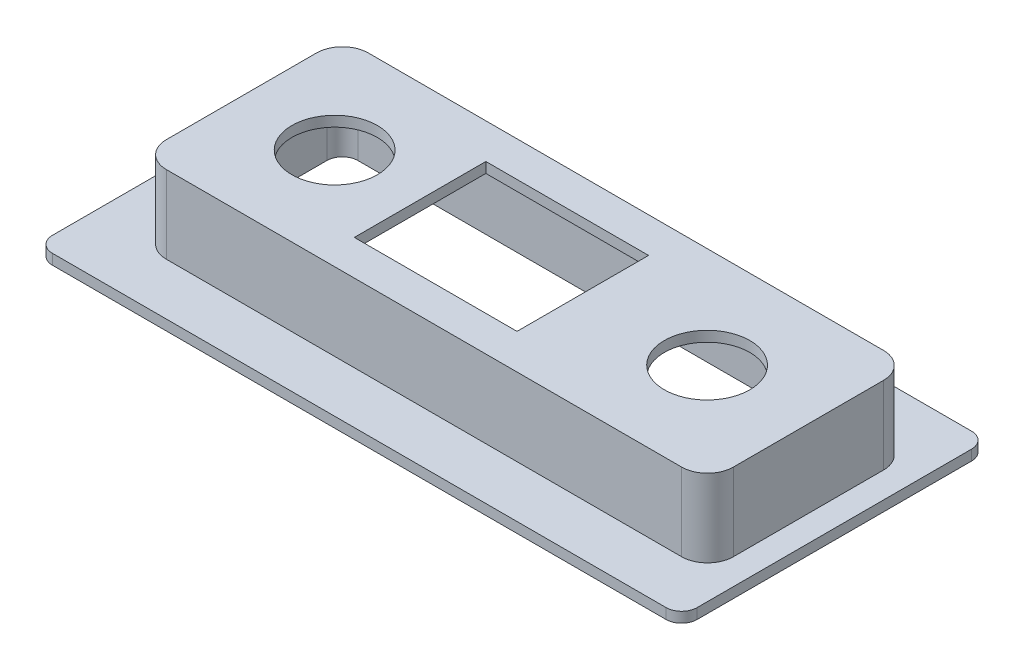
ISO-10303-21;
HEADER;
FILE_DESCRIPTION(('STEP AP214'),'2;1');
FILE_NAME('part.step','',(''),(''),'','','');
FILE_SCHEMA(('AUTOMOTIVE_DESIGN { 1 0 10303 214 1 1 1 1 }'));
ENDSEC;
DATA;
#1=APPLICATION_CONTEXT('core data for automotive mechanical design processes');
#2=APPLICATION_PROTOCOL_DEFINITION('international standard','automotive_design',2000,#1);
#3=PRODUCT_CONTEXT('',#1,'mechanical');
#4=PRODUCT('Part','Part','',(#3));
#5=PRODUCT_RELATED_PRODUCT_CATEGORY('part','',(#4));
#6=PRODUCT_DEFINITION_FORMATION('','',#4);
#7=PRODUCT_DEFINITION_CONTEXT('part definition',#1,'design');
#8=PRODUCT_DEFINITION('design','',#6,#7);
#9=PRODUCT_DEFINITION_SHAPE('','',#8);
#10=(LENGTH_UNIT() NAMED_UNIT(*) SI_UNIT(.MILLI.,.METRE.));
#11=(NAMED_UNIT(*) PLANE_ANGLE_UNIT() SI_UNIT($,.RADIAN.));
#12=(NAMED_UNIT(*) SI_UNIT($,.STERADIAN.) SOLID_ANGLE_UNIT());
#13=UNCERTAINTY_MEASURE_WITH_UNIT(LENGTH_MEASURE(1.E-05),#10,'distance_accuracy_value','');
#14=(GEOMETRIC_REPRESENTATION_CONTEXT(3) GLOBAL_UNCERTAINTY_ASSIGNED_CONTEXT((#13)) GLOBAL_UNIT_ASSIGNED_CONTEXT((#10,
#11,#12)) REPRESENTATION_CONTEXT('',''));
#15=CARTESIAN_POINT('',(0.,0.,0.));
#16=DIRECTION('',(0.,0.,1.));
#17=DIRECTION('',(1.,0.,0.));
#18=AXIS2_PLACEMENT_3D('',#15,#16,#17);
#19=CARTESIAN_POINT('',(44.,-17.,19.5));
#20=DIRECTION('',(0.,0.,-1.));
#21=DIRECTION('',(-1.,0.,0.));
#22=AXIS2_PLACEMENT_3D('',#19,#20,#21);
#23=PLANE('',#22);
#24=DIRECTION('',(-1.,0.,0.));
#25=VECTOR('',#24,1.);
#26=CARTESIAN_POINT('',(-44.,-15.,19.5));
#27=LINE('',#26,#25);
#28=CARTESIAN_POINT('',(58.5,-15.,19.5));
#29=VERTEX_POINT('',#28);
#30=CARTESIAN_POINT('',(-41.,-15.,19.5));
#31=VERTEX_POINT('',#30);
#32=EDGE_CURVE('E239',#29,#31,#27,.T.);
#33=ORIENTED_EDGE('',*,*,#32,.F.);
#34=DIRECTION('',(0.,1.,0.));
#35=VECTOR('',#34,1.);
#36=CARTESIAN_POINT('',(58.5,-17.,19.5));
#37=LINE('',#36,#35);
#38=CARTESIAN_POINT('',(58.5,0.,19.5));
#39=VERTEX_POINT('',#38);
#40=EDGE_CURVE('E390',#29,#39,#37,.T.);
#41=ORIENTED_EDGE('',*,*,#40,.T.);
#42=DIRECTION('',(-1.,0.,0.));
#43=VECTOR('',#42,1.);
#44=CARTESIAN_POINT('',(44.,0.,19.5));
#45=LINE('',#44,#43);
#46=CARTESIAN_POINT('',(-41.,0.,19.5));
#47=VERTEX_POINT('',#46);
#48=EDGE_CURVE('E210',#39,#47,#45,.T.);
#49=ORIENTED_EDGE('',*,*,#48,.T.);
#50=DIRECTION('',(0.,1.,0.));
#51=VECTOR('',#50,1.);
#52=CARTESIAN_POINT('',(-41.,-17.,19.5));
#53=LINE('',#52,#51);
#54=EDGE_CURVE('E350',#47,#31,#53,.F.);
#55=ORIENTED_EDGE('',*,*,#54,.T.);
#56=EDGE_LOOP('',(#33,#41,#49,#55));
#57=FACE_BOUND('',#56,.T.);
#58=ADVANCED_FACE('F18',(#57),#23,.F.);
#59=CARTESIAN_POINT('',(44.,-17.,-19.5));
#60=DIRECTION('',(0.,0.,1.));
#61=DIRECTION('',(1.,0.,0.));
#62=AXIS2_PLACEMENT_3D('',#59,#60,#61);
#63=PLANE('',#62);
#64=DIRECTION('',(1.,0.,0.));
#65=VECTOR('',#64,1.);
#66=CARTESIAN_POINT('',(44.,0.,-19.5));
#67=LINE('',#66,#65);
#68=CARTESIAN_POINT('',(-41.,0.,-19.5));
#69=VERTEX_POINT('',#68);
#70=CARTESIAN_POINT('',(58.5,0.,-19.5));
#71=VERTEX_POINT('',#70);
#72=EDGE_CURVE('E192',#69,#71,#67,.T.);
#73=ORIENTED_EDGE('',*,*,#72,.T.);
#74=DIRECTION('',(0.,1.,0.));
#75=VECTOR('',#74,1.);
#76=CARTESIAN_POINT('',(58.5,-17.,-19.5));
#77=LINE('',#76,#75);
#78=CARTESIAN_POINT('',(58.5,-15.,-19.5));
#79=VERTEX_POINT('',#78);
#80=EDGE_CURVE('E382',#71,#79,#77,.F.);
#81=ORIENTED_EDGE('',*,*,#80,.T.);
#82=DIRECTION('',(1.,0.,0.));
#83=VECTOR('',#82,1.);
#84=CARTESIAN_POINT('',(-56.,-15.,-19.5));
#85=LINE('',#84,#83);
#86=CARTESIAN_POINT('',(-41.,-15.,-19.5));
#87=VERTEX_POINT('',#86);
#88=EDGE_CURVE('E105',#87,#79,#85,.T.);
#89=ORIENTED_EDGE('',*,*,#88,.F.);
#90=DIRECTION('',(0.,1.,0.));
#91=VECTOR('',#90,1.);
#92=CARTESIAN_POINT('',(-41.,-17.,-19.5));
#93=LINE('',#92,#91);
#94=EDGE_CURVE('E358',#87,#69,#93,.T.);
#95=ORIENTED_EDGE('',*,*,#94,.T.);
#96=EDGE_LOOP('',(#73,#81,#89,#95));
#97=FACE_BOUND('',#96,.T.);
#98=ADVANCED_FACE('F495',(#97),#63,.F.);
#99=CARTESIAN_POINT('',(63.5,-17.,19.5));
#100=DIRECTION('',(-1.,0.,0.));
#101=DIRECTION('',(0.,0.,1.));
#102=AXIS2_PLACEMENT_3D('',#99,#100,#101);
#103=PLANE('',#102);
#104=DIRECTION('',(0.,0.,-1.));
#105=VECTOR('',#104,1.);
#106=CARTESIAN_POINT('',(63.5,0.,19.5));
#107=LINE('',#106,#105);
#108=CARTESIAN_POINT('',(63.5,0.,14.5));
#109=VERTEX_POINT('',#108);
#110=CARTESIAN_POINT('',(63.5,0.,-14.5));
#111=VERTEX_POINT('',#110);
#112=EDGE_CURVE('E173',#109,#111,#107,.T.);
#113=ORIENTED_EDGE('',*,*,#112,.F.);
#114=DIRECTION('',(0.,1.,0.));
#115=VECTOR('',#114,1.);
#116=CARTESIAN_POINT('',(63.5,-17.,14.5));
#117=LINE('',#116,#115);
#118=CARTESIAN_POINT('',(63.5,-15.,14.5));
#119=VERTEX_POINT('',#118);
#120=EDGE_CURVE('E29',#109,#119,#117,.F.);
#121=ORIENTED_EDGE('',*,*,#120,.T.);
#122=DIRECTION('',(0.,0.,1.));
#123=VECTOR('',#122,1.);
#124=CARTESIAN_POINT('',(63.5,-15.,19.5));
#125=LINE('',#124,#123);
#126=CARTESIAN_POINT('',(63.5,-15.,-14.5));
#127=VERTEX_POINT('',#126);
#128=EDGE_CURVE('E160',#127,#119,#125,.T.);
#129=ORIENTED_EDGE('',*,*,#128,.F.);
#130=DIRECTION('',(0.,1.,0.));
#131=VECTOR('',#130,1.);
#132=CARTESIAN_POINT('',(63.5,-17.,-14.5));
#133=LINE('',#132,#131);
#134=EDGE_CURVE('E374',#127,#111,#133,.T.);
#135=ORIENTED_EDGE('',*,*,#134,.T.);
#136=EDGE_LOOP('',(#113,#121,#129,#135));
#137=FACE_BOUND('',#136,.T.);
#138=ADVANCED_FACE('F500',(#137),#103,.F.);
#139=CARTESIAN_POINT('',(44.,-17.,0.));
#140=DIRECTION('',(0.,-1.,0.));
#141=DIRECTION('',(0.,0.,-1.));
#142=AXIS2_PLACEMENT_3D('',#139,#140,#141);
#143=PLANE('',#142);
#144=CARTESIAN_POINT('',(38.75,-17.,-24.5));
#145=DIRECTION('',(0.,1.,0.));
#146=DIRECTION('',(1.,0.,0.));
#147=AXIS2_PLACEMENT_3D('',#144,#145,#146);
#148=CIRCLE('',#147,2.25);
#149=CARTESIAN_POINT('',(41.,-17.,-24.5));
#150=VERTEX_POINT('',#149);
#151=EDGE_CURVE('E408',#150,#150,#148,.T.);
#152=ORIENTED_EDGE('',*,*,#151,.T.);
#153=EDGE_LOOP('',(#152));
#154=FACE_BOUND('',#153,.T.);
#155=CARTESIAN_POINT('',(-21.25,-17.,-24.5));
#156=DIRECTION('',(0.,1.,0.));
#157=DIRECTION('',(1.,0.,0.));
#158=AXIS2_PLACEMENT_3D('',#155,#156,#157);
#159=CIRCLE('',#158,2.25);
#160=CARTESIAN_POINT('',(-19.,-17.,-24.5));
#161=VERTEX_POINT('',#160);
#162=EDGE_CURVE('E403',#161,#161,#159,.T.);
#163=ORIENTED_EDGE('',*,*,#162,.T.);
#164=EDGE_LOOP('',(#163));
#165=FACE_BOUND('',#164,.T.);
#166=CARTESIAN_POINT('',(-51.,-17.,0.));
#167=DIRECTION('',(0.,-1.,0.));
#168=DIRECTION('',(0.,0.,-1.));
#169=AXIS2_PLACEMENT_3D('',#166,#167,#168);
#170=CIRCLE('',#169,2.25);
#171=CARTESIAN_POINT('',(-51.,-17.,-2.25));
#172=VERTEX_POINT('',#171);
#173=EDGE_CURVE('E159',#172,#172,#170,.F.);
#174=ORIENTED_EDGE('',*,*,#173,.T.);
#175=EDGE_LOOP('',(#174));
#176=FACE_BOUND('',#175,.T.);
#177=DIRECTION('',(1.,0.,0.));
#178=VECTOR('',#177,1.);
#179=CARTESIAN_POINT('',(73.5,-17.,29.5));
#180=LINE('',#179,#178);
#181=CARTESIAN_POINT('',(-53.,-17.,29.5));
#182=VERTEX_POINT('',#181);
#183=CARTESIAN_POINT('',(65.5,-17.,29.5));
#184=VERTEX_POINT('',#183);
#185=EDGE_CURVE('E108',#182,#184,#180,.T.);
#186=ORIENTED_EDGE('',*,*,#185,.F.);
#187=CARTESIAN_POINT('',(-53.,-17.,26.5));
#188=DIRECTION('',(0.,-1.,0.));
#189=DIRECTION('',(0.,0.,-1.));
#190=AXIS2_PLACEMENT_3D('',#187,#188,#189);
#191=CIRCLE('',#190,3.);
#192=CARTESIAN_POINT('',(-56.,-17.,26.5));
#193=VERTEX_POINT('',#192);
#194=EDGE_CURVE('E266',#182,#193,#191,.T.);
#195=ORIENTED_EDGE('',*,*,#194,.T.);
#196=DIRECTION('',(0.,0.,-1.));
#197=VECTOR('',#196,1.);
#198=CARTESIAN_POINT('',(-56.,-17.,19.5));
#199=LINE('',#198,#197);
#200=CARTESIAN_POINT('',(-56.,-17.,-26.5));
#201=VERTEX_POINT('',#200);
#202=EDGE_CURVE('E163',#193,#201,#199,.T.);
#203=ORIENTED_EDGE('',*,*,#202,.T.);
#204=CARTESIAN_POINT('',(-53.,-17.,-26.5));
#205=DIRECTION('',(0.,-1.,0.));
#206=DIRECTION('',(0.,0.,-1.));
#207=AXIS2_PLACEMENT_3D('',#204,#205,#206);
#208=CIRCLE('',#207,3.);
#209=CARTESIAN_POINT('',(-53.,-17.,-29.5));
#210=VERTEX_POINT('',#209);
#211=EDGE_CURVE('E96',#201,#210,#208,.T.);
#212=ORIENTED_EDGE('',*,*,#211,.T.);
#213=DIRECTION('',(-1.,0.,0.));
#214=VECTOR('',#213,1.);
#215=CARTESIAN_POINT('',(-56.,-17.,-29.5));
#216=LINE('',#215,#214);
#217=CARTESIAN_POINT('',(65.5,-17.,-29.5));
#218=VERTEX_POINT('',#217);
#219=EDGE_CURVE('E84',#218,#210,#216,.T.);
#220=ORIENTED_EDGE('',*,*,#219,.F.);
#221=CARTESIAN_POINT('',(65.5,-17.,-26.5));
#222=DIRECTION('',(0.,-1.,0.));
#223=DIRECTION('',(0.,0.,-1.));
#224=AXIS2_PLACEMENT_3D('',#221,#222,#223);
#225=CIRCLE('',#224,3.);
#226=CARTESIAN_POINT('',(68.5,-17.,-26.5));
#227=VERTEX_POINT('',#226);
#228=EDGE_CURVE('E22',#218,#227,#225,.T.);
#229=ORIENTED_EDGE('',*,*,#228,.T.);
#230=DIRECTION('',(0.,0.,-1.));
#231=VECTOR('',#230,1.);
#232=CARTESIAN_POINT('',(68.5,-17.,-19.5));
#233=LINE('',#232,#231);
#234=CARTESIAN_POINT('',(68.5,-17.,26.5));
#235=VERTEX_POINT('',#234);
#236=EDGE_CURVE('E247',#235,#227,#233,.T.);
#237=ORIENTED_EDGE('',*,*,#236,.F.);
#238=CARTESIAN_POINT('',(65.5,-17.,26.5));
#239=DIRECTION('',(0.,-1.,0.));
#240=DIRECTION('',(0.,0.,-1.));
#241=AXIS2_PLACEMENT_3D('',#238,#239,#240);
#242=CIRCLE('',#241,3.);
#243=EDGE_CURVE('E415',#235,#184,#242,.T.);
#244=ORIENTED_EDGE('',*,*,#243,.T.);
#245=EDGE_LOOP('',(#186,#195,#203,#212,#220,#229,#237,#244));
#246=FACE_BOUND('',#245,.T.);
#247=DIRECTION('',(0.,0.,-1.));
#248=VECTOR('',#247,1.);
#249=CARTESIAN_POINT('',(61.5,-17.,19.5));
#250=LINE('',#249,#248);
#251=CARTESIAN_POINT('',(61.5,-17.,14.5));
#252=VERTEX_POINT('',#251);
#253=CARTESIAN_POINT('',(61.5,-17.,-14.5));
#254=VERTEX_POINT('',#253);
#255=EDGE_CURVE('E179',#252,#254,#250,.T.);
#256=ORIENTED_EDGE('',*,*,#255,.T.);
#257=CARTESIAN_POINT('',(58.5,-17.,-14.5));
#258=DIRECTION('',(0.,-1.,0.));
#259=DIRECTION('',(0.,0.,-1.));
#260=AXIS2_PLACEMENT_3D('',#257,#258,#259);
#261=CIRCLE('',#260,3.);
#262=CARTESIAN_POINT('',(58.5,-17.,-17.5));
#263=VERTEX_POINT('',#262);
#264=EDGE_CURVE('E338',#254,#263,#261,.F.);
#265=ORIENTED_EDGE('',*,*,#264,.T.);
#266=DIRECTION('',(-1.,0.,0.));
#267=VECTOR('',#266,1.);
#268=CARTESIAN_POINT('',(44.,-17.,-17.5));
#269=LINE('',#268,#267);
#270=CARTESIAN_POINT('',(-41.,-17.,-17.5));
#271=VERTEX_POINT('',#270);
#272=EDGE_CURVE('E205',#263,#271,#269,.T.);
#273=ORIENTED_EDGE('',*,*,#272,.T.);
#274=CARTESIAN_POINT('',(-41.,-17.,-14.5));
#275=DIRECTION('',(0.,-1.,0.));
#276=DIRECTION('',(0.,0.,-1.));
#277=AXIS2_PLACEMENT_3D('',#274,#275,#276);
#278=CIRCLE('',#277,3.);
#279=CARTESIAN_POINT('',(-44.,-17.,-14.5));
#280=VERTEX_POINT('',#279);
#281=EDGE_CURVE('E322',#271,#280,#278,.F.);
#282=ORIENTED_EDGE('',*,*,#281,.T.);
#283=DIRECTION('',(0.,0.,1.));
#284=VECTOR('',#283,1.);
#285=CARTESIAN_POINT('',(-44.,-17.,-17.5));
#286=LINE('',#285,#284);
#287=CARTESIAN_POINT('',(-44.,-17.,14.5));
#288=VERTEX_POINT('',#287);
#289=EDGE_CURVE('E200',#280,#288,#286,.T.);
#290=ORIENTED_EDGE('',*,*,#289,.T.);
#291=CARTESIAN_POINT('',(-41.,-17.,14.5));
#292=DIRECTION('',(0.,-1.,0.));
#293=DIRECTION('',(0.,0.,-1.));
#294=AXIS2_PLACEMENT_3D('',#291,#292,#293);
#295=CIRCLE('',#294,3.);
#296=CARTESIAN_POINT('',(-41.,-17.,17.5));
#297=VERTEX_POINT('',#296);
#298=EDGE_CURVE('E306',#288,#297,#295,.F.);
#299=ORIENTED_EDGE('',*,*,#298,.T.);
#300=DIRECTION('',(1.,0.,0.));
#301=VECTOR('',#300,1.);
#302=CARTESIAN_POINT('',(-44.,-17.,17.5));
#303=LINE('',#302,#301);
#304=CARTESIAN_POINT('',(58.5,-17.,17.5));
#305=VERTEX_POINT('',#304);
#306=EDGE_CURVE('E196',#297,#305,#303,.T.);
#307=ORIENTED_EDGE('',*,*,#306,.T.);
#308=CARTESIAN_POINT('',(58.5,-17.,14.5));
#309=DIRECTION('',(0.,-1.,0.));
#310=DIRECTION('',(0.,0.,-1.));
#311=AXIS2_PLACEMENT_3D('',#308,#309,#310);
#312=CIRCLE('',#311,3.);
#313=EDGE_CURVE('E290',#305,#252,#312,.F.);
#314=ORIENTED_EDGE('',*,*,#313,.T.);
#315=EDGE_LOOP('',(#256,#265,#273,#282,#290,#299,#307,#314));
#316=FACE_BOUND('',#315,.T.);
#317=ADVANCED_FACE('F92',(#154,#165,#176,#246,#316),#143,.T.);
#318=CARTESIAN_POINT('',(44.,0.,0.));
#319=DIRECTION('',(0.,-1.,0.));
#320=DIRECTION('',(0.,0.,-1.));
#321=AXIS2_PLACEMENT_3D('',#318,#319,#320);
#322=PLANE('',#321);
#323=CARTESIAN_POINT('',(43.92,0.,0.));
#324=DIRECTION('',(0.,-1.,0.));
#325=DIRECTION('',(0.,0.,-1.));
#326=AXIS2_PLACEMENT_3D('',#323,#324,#325);
#327=CIRCLE('',#326,8.25);
#328=CARTESIAN_POINT('',(43.92,0.,-8.25));
#329=VERTEX_POINT('',#328);
#330=EDGE_CURVE('E116',#329,#329,#327,.F.);
#331=ORIENTED_EDGE('',*,*,#330,.F.);
#332=EDGE_LOOP('',(#331));
#333=FACE_BOUND('',#332,.T.);
#334=CARTESIAN_POINT('',(-28.,0.,0.));
#335=DIRECTION('',(0.,-1.,0.));
#336=DIRECTION('',(0.,0.,-1.));
#337=AXIS2_PLACEMENT_3D('',#334,#335,#336);
#338=CIRCLE('',#337,8.25);
#339=CARTESIAN_POINT('',(-28.,0.,-8.25));
#340=VERTEX_POINT('',#339);
#341=EDGE_CURVE('E124',#340,#340,#338,.F.);
#342=ORIENTED_EDGE('',*,*,#341,.F.);
#343=EDGE_LOOP('',(#342));
#344=FACE_BOUND('',#343,.T.);
#345=DIRECTION('',(0.,0.,1.));
#346=VECTOR('',#345,1.);
#347=CARTESIAN_POINT('',(19.92,0.,0.));
#348=LINE('',#347,#346);
#349=CARTESIAN_POINT('',(19.92,0.,-12.7));
#350=VERTEX_POINT('',#349);
#351=CARTESIAN_POINT('',(19.92,0.,12.7));
#352=VERTEX_POINT('',#351);
#353=EDGE_CURVE('E223',#350,#352,#348,.T.);
#354=ORIENTED_EDGE('',*,*,#353,.T.);
#355=DIRECTION('',(-1.,0.,0.));
#356=VECTOR('',#355,1.);
#357=CARTESIAN_POINT('',(44.,0.,12.7));
#358=LINE('',#357,#356);
#359=CARTESIAN_POINT('',(-11.5,0.,12.7));
#360=VERTEX_POINT('',#359);
#361=EDGE_CURVE('E235',#352,#360,#358,.T.);
#362=ORIENTED_EDGE('',*,*,#361,.T.);
#363=DIRECTION('',(0.,0.,-1.));
#364=VECTOR('',#363,1.);
#365=CARTESIAN_POINT('',(-11.5,0.,0.));
#366=LINE('',#365,#364);
#367=CARTESIAN_POINT('',(-11.5,0.,-12.7));
#368=VERTEX_POINT('',#367);
#369=EDGE_CURVE('E231',#360,#368,#366,.T.);
#370=ORIENTED_EDGE('',*,*,#369,.T.);
#371=DIRECTION('',(1.,0.,0.));
#372=VECTOR('',#371,1.);
#373=CARTESIAN_POINT('',(44.,0.,-12.7));
#374=LINE('',#373,#372);
#375=EDGE_CURVE('E227',#368,#350,#374,.T.);
#376=ORIENTED_EDGE('',*,*,#375,.T.);
#377=EDGE_LOOP('',(#354,#362,#370,#376));
#378=FACE_BOUND('',#377,.T.);
#379=ORIENTED_EDGE('',*,*,#48,.F.);
#380=CARTESIAN_POINT('',(58.5,0.,14.5));
#381=DIRECTION('',(0.,-1.,0.));
#382=DIRECTION('',(0.,0.,-1.));
#383=AXIS2_PLACEMENT_3D('',#380,#381,#382);
#384=CIRCLE('',#383,5.);
#385=EDGE_CURVE('E394',#39,#109,#384,.F.);
#386=ORIENTED_EDGE('',*,*,#385,.T.);
#387=ORIENTED_EDGE('',*,*,#112,.T.);
#388=CARTESIAN_POINT('',(58.5,0.,-14.5));
#389=DIRECTION('',(0.,-1.,0.));
#390=DIRECTION('',(0.,0.,-1.));
#391=AXIS2_PLACEMENT_3D('',#388,#389,#390);
#392=CIRCLE('',#391,5.);
#393=EDGE_CURVE('E378',#111,#71,#392,.F.);
#394=ORIENTED_EDGE('',*,*,#393,.T.);
#395=ORIENTED_EDGE('',*,*,#72,.F.);
#396=CARTESIAN_POINT('',(-41.,0.,-14.5));
#397=DIRECTION('',(0.,-1.,0.));
#398=DIRECTION('',(0.,0.,-1.));
#399=AXIS2_PLACEMENT_3D('',#396,#397,#398);
#400=CIRCLE('',#399,5.);
#401=CARTESIAN_POINT('',(-46.,0.,-14.5));
#402=VERTEX_POINT('',#401);
#403=EDGE_CURVE('E362',#69,#402,#400,.F.);
#404=ORIENTED_EDGE('',*,*,#403,.T.);
#405=DIRECTION('',(0.,0.,-1.));
#406=VECTOR('',#405,1.);
#407=CARTESIAN_POINT('',(-46.,0.,-19.5));
#408=LINE('',#407,#406);
#409=CARTESIAN_POINT('',(-46.,0.,14.5));
#410=VERTEX_POINT('',#409);
#411=EDGE_CURVE('E201',#410,#402,#408,.T.);
#412=ORIENTED_EDGE('',*,*,#411,.F.);
#413=CARTESIAN_POINT('',(-41.,0.,14.5));
#414=DIRECTION('',(0.,-1.,0.));
#415=DIRECTION('',(0.,0.,-1.));
#416=AXIS2_PLACEMENT_3D('',#413,#414,#415);
#417=CIRCLE('',#416,5.);
#418=EDGE_CURVE('E346',#410,#47,#417,.F.);
#419=ORIENTED_EDGE('',*,*,#418,.T.);
#420=EDGE_LOOP('',(#379,#386,#387,#394,#395,#404,#412,#419));
#421=FACE_BOUND('',#420,.T.);
#422=ADVANCED_FACE('F595',(#333,#344,#378,#421),#322,.F.);
#423=CARTESIAN_POINT('',(44.,-2.,0.));
#424=DIRECTION('',(0.,-1.,0.));
#425=DIRECTION('',(0.,0.,-1.));
#426=AXIS2_PLACEMENT_3D('',#423,#424,#425);
#427=PLANE('',#426);
#428=CARTESIAN_POINT('',(43.92,-2.,0.));
#429=DIRECTION('',(0.,1.,0.));
#430=DIRECTION('',(1.,0.,0.));
#431=AXIS2_PLACEMENT_3D('',#428,#429,#430);
#432=CIRCLE('',#431,8.25);
#433=CARTESIAN_POINT('',(52.17,-2.,0.));
#434=VERTEX_POINT('',#433);
#435=EDGE_CURVE('E112',#434,#434,#432,.T.);
#436=ORIENTED_EDGE('',*,*,#435,.T.);
#437=EDGE_LOOP('',(#436));
#438=FACE_BOUND('',#437,.T.);
#439=CARTESIAN_POINT('',(-28.,-2.,0.));
#440=DIRECTION('',(0.,1.,0.));
#441=DIRECTION('',(-1.,0.,0.));
#442=AXIS2_PLACEMENT_3D('',#439,#440,#441);
#443=CIRCLE('',#442,8.25);
#444=CARTESIAN_POINT('',(-36.25,-2.,0.));
#445=VERTEX_POINT('',#444);
#446=EDGE_CURVE('E120',#445,#445,#443,.T.);
#447=ORIENTED_EDGE('',*,*,#446,.T.);
#448=EDGE_LOOP('',(#447));
#449=FACE_BOUND('',#448,.T.);
#450=DIRECTION('',(-1.,0.,0.));
#451=VECTOR('',#450,1.);
#452=CARTESIAN_POINT('',(19.92,-2.,12.7));
#453=LINE('',#452,#451);
#454=CARTESIAN_POINT('',(19.92,-2.,12.7));
#455=VERTEX_POINT('',#454);
#456=CARTESIAN_POINT('',(-11.5,-2.,12.7));
#457=VERTEX_POINT('',#456);
#458=EDGE_CURVE('E128',#455,#457,#453,.T.);
#459=ORIENTED_EDGE('',*,*,#458,.F.);
#460=DIRECTION('',(0.,0.,1.));
#461=VECTOR('',#460,1.);
#462=CARTESIAN_POINT('',(19.92,-2.,0.));
#463=LINE('',#462,#461);
#464=CARTESIAN_POINT('',(19.92,-2.,-12.7));
#465=VERTEX_POINT('',#464);
#466=EDGE_CURVE('E137',#465,#455,#463,.T.);
#467=ORIENTED_EDGE('',*,*,#466,.F.);
#468=DIRECTION('',(1.,0.,0.));
#469=VECTOR('',#468,1.);
#470=CARTESIAN_POINT('',(-11.5,-2.,-12.7));
#471=LINE('',#470,#469);
#472=CARTESIAN_POINT('',(-11.5,-2.,-12.7));
#473=VERTEX_POINT('',#472);
#474=EDGE_CURVE('E133',#473,#465,#471,.T.);
#475=ORIENTED_EDGE('',*,*,#474,.F.);
#476=DIRECTION('',(0.,0.,-1.));
#477=VECTOR('',#476,1.);
#478=CARTESIAN_POINT('',(-11.5,-2.,0.));
#479=LINE('',#478,#477);
#480=EDGE_CURVE('E129',#457,#473,#479,.T.);
#481=ORIENTED_EDGE('',*,*,#480,.F.);
#482=EDGE_LOOP('',(#459,#467,#475,#481));
#483=FACE_BOUND('',#482,.T.);
#484=DIRECTION('',(1.,0.,0.));
#485=VECTOR('',#484,1.);
#486=CARTESIAN_POINT('',(44.,-2.,-17.5));
#487=LINE('',#486,#485);
#488=CARTESIAN_POINT('',(-41.,-2.,-17.5));
#489=VERTEX_POINT('',#488);
#490=CARTESIAN_POINT('',(58.5,-2.,-17.5));
#491=VERTEX_POINT('',#490);
#492=EDGE_CURVE('E183',#489,#491,#487,.T.);
#493=ORIENTED_EDGE('',*,*,#492,.T.);
#494=CARTESIAN_POINT('',(58.5,-2.,-14.5));
#495=DIRECTION('',(0.,-1.,0.));
#496=DIRECTION('',(0.,0.,-1.));
#497=AXIS2_PLACEMENT_3D('',#494,#495,#496);
#498=CIRCLE('',#497,3.);
#499=CARTESIAN_POINT('',(61.5,-2.,-14.5));
#500=VERTEX_POINT('',#499);
#501=EDGE_CURVE('E330',#491,#500,#498,.T.);
#502=ORIENTED_EDGE('',*,*,#501,.T.);
#503=DIRECTION('',(0.,0.,1.));
#504=VECTOR('',#503,1.);
#505=CARTESIAN_POINT('',(61.5,-2.,0.));
#506=LINE('',#505,#504);
#507=CARTESIAN_POINT('',(61.5,-2.,14.5));
#508=VERTEX_POINT('',#507);
#509=EDGE_CURVE('E209',#500,#508,#506,.T.);
#510=ORIENTED_EDGE('',*,*,#509,.T.);
#511=CARTESIAN_POINT('',(58.5,-2.,14.5));
#512=DIRECTION('',(0.,-1.,0.));
#513=DIRECTION('',(0.,0.,-1.));
#514=AXIS2_PLACEMENT_3D('',#511,#512,#513);
#515=CIRCLE('',#514,3.);
#516=CARTESIAN_POINT('',(58.5,-2.,17.5));
#517=VERTEX_POINT('',#516);
#518=EDGE_CURVE('E282',#508,#517,#515,.T.);
#519=ORIENTED_EDGE('',*,*,#518,.T.);
#520=DIRECTION('',(-1.,0.,0.));
#521=VECTOR('',#520,1.);
#522=CARTESIAN_POINT('',(-44.,-2.,17.5));
#523=LINE('',#522,#521);
#524=CARTESIAN_POINT('',(-41.,-2.,17.5));
#525=VERTEX_POINT('',#524);
#526=EDGE_CURVE('E184',#517,#525,#523,.T.);
#527=ORIENTED_EDGE('',*,*,#526,.T.);
#528=CARTESIAN_POINT('',(-41.,-2.,14.5));
#529=DIRECTION('',(0.,-1.,0.));
#530=DIRECTION('',(0.,0.,-1.));
#531=AXIS2_PLACEMENT_3D('',#528,#529,#530);
#532=CIRCLE('',#531,3.);
#533=CARTESIAN_POINT('',(-44.,-2.,14.5));
#534=VERTEX_POINT('',#533);
#535=EDGE_CURVE('E298',#525,#534,#532,.T.);
#536=ORIENTED_EDGE('',*,*,#535,.T.);
#537=DIRECTION('',(0.,0.,-1.));
#538=VECTOR('',#537,1.);
#539=CARTESIAN_POINT('',(-44.,-2.,-17.5));
#540=LINE('',#539,#538);
#541=CARTESIAN_POINT('',(-44.,-2.,-14.5));
#542=VERTEX_POINT('',#541);
#543=EDGE_CURVE('E188',#534,#542,#540,.T.);
#544=ORIENTED_EDGE('',*,*,#543,.T.);
#545=CARTESIAN_POINT('',(-41.,-2.,-14.5));
#546=DIRECTION('',(0.,-1.,0.));
#547=DIRECTION('',(0.,0.,-1.));
#548=AXIS2_PLACEMENT_3D('',#545,#546,#547);
#549=CIRCLE('',#548,3.);
#550=EDGE_CURVE('E314',#542,#489,#549,.T.);
#551=ORIENTED_EDGE('',*,*,#550,.T.);
#552=EDGE_LOOP('',(#493,#502,#510,#519,#527,#536,#544,#551));
#553=FACE_BOUND('',#552,.T.);
#554=ADVANCED_FACE('F591',(#438,#449,#483,#553),#427,.T.);
#555=CARTESIAN_POINT('',(44.,-17.,-17.5));
#556=DIRECTION('',(0.,0.,-1.));
#557=DIRECTION('',(-1.,0.,0.));
#558=AXIS2_PLACEMENT_3D('',#555,#556,#557);
#559=PLANE('',#558);
#560=ORIENTED_EDGE('',*,*,#272,.F.);
#561=DIRECTION('',(0.,1.,0.));
#562=VECTOR('',#561,1.);
#563=CARTESIAN_POINT('',(58.5,-2.,-17.5));
#564=LINE('',#563,#562);
#565=EDGE_CURVE('E326',#263,#491,#564,.T.);
#566=ORIENTED_EDGE('',*,*,#565,.T.);
#567=ORIENTED_EDGE('',*,*,#492,.F.);
#568=DIRECTION('',(0.,1.,0.));
#569=VECTOR('',#568,1.);
#570=CARTESIAN_POINT('',(-41.,-17.,-17.5));
#571=LINE('',#570,#569);
#572=EDGE_CURVE('E318',#489,#271,#571,.F.);
#573=ORIENTED_EDGE('',*,*,#572,.T.);
#574=EDGE_LOOP('',(#560,#566,#567,#573));
#575=FACE_BOUND('',#574,.T.);
#576=ADVANCED_FACE('F594',(#575),#559,.F.);
#577=CARTESIAN_POINT('',(-44.,-17.,-17.5));
#578=DIRECTION('',(-1.,0.,0.));
#579=DIRECTION('',(0.,0.,1.));
#580=AXIS2_PLACEMENT_3D('',#577,#578,#579);
#581=PLANE('',#580);
#582=ORIENTED_EDGE('',*,*,#289,.F.);
#583=DIRECTION('',(0.,1.,0.));
#584=VECTOR('',#583,1.);
#585=CARTESIAN_POINT('',(-44.,-2.,-14.5));
#586=LINE('',#585,#584);
#587=EDGE_CURVE('E310',#280,#542,#586,.T.);
#588=ORIENTED_EDGE('',*,*,#587,.T.);
#589=ORIENTED_EDGE('',*,*,#543,.F.);
#590=DIRECTION('',(0.,1.,0.));
#591=VECTOR('',#590,1.);
#592=CARTESIAN_POINT('',(-44.,-17.,14.5));
#593=LINE('',#592,#591);
#594=EDGE_CURVE('E302',#534,#288,#593,.F.);
#595=ORIENTED_EDGE('',*,*,#594,.T.);
#596=EDGE_LOOP('',(#582,#588,#589,#595));
#597=FACE_BOUND('',#596,.T.);
#598=ADVANCED_FACE('F604',(#597),#581,.F.);
#599=CARTESIAN_POINT('',(-44.,-17.,17.5));
#600=DIRECTION('',(0.,0.,1.));
#601=DIRECTION('',(1.,0.,0.));
#602=AXIS2_PLACEMENT_3D('',#599,#600,#601);
#603=PLANE('',#602);
#604=ORIENTED_EDGE('',*,*,#306,.F.);
#605=DIRECTION('',(0.,1.,0.));
#606=VECTOR('',#605,1.);
#607=CARTESIAN_POINT('',(-41.,-2.,17.5));
#608=LINE('',#607,#606);
#609=EDGE_CURVE('E294',#297,#525,#608,.T.);
#610=ORIENTED_EDGE('',*,*,#609,.T.);
#611=ORIENTED_EDGE('',*,*,#526,.F.);
#612=DIRECTION('',(0.,1.,0.));
#613=VECTOR('',#612,1.);
#614=CARTESIAN_POINT('',(58.5,-17.,17.5));
#615=LINE('',#614,#613);
#616=EDGE_CURVE('E286',#517,#305,#615,.F.);
#617=ORIENTED_EDGE('',*,*,#616,.T.);
#618=EDGE_LOOP('',(#604,#610,#611,#617));
#619=FACE_BOUND('',#618,.T.);
#620=ADVANCED_FACE('F607',(#619),#603,.F.);
#621=CARTESIAN_POINT('',(-46.,-17.,-19.5));
#622=DIRECTION('',(1.,0.,0.));
#623=DIRECTION('',(0.,0.,-1.));
#624=AXIS2_PLACEMENT_3D('',#621,#622,#623);
#625=PLANE('',#624);
#626=ORIENTED_EDGE('',*,*,#411,.T.);
#627=DIRECTION('',(0.,1.,0.));
#628=VECTOR('',#627,1.);
#629=CARTESIAN_POINT('',(-46.,-17.,-14.5));
#630=LINE('',#629,#628);
#631=CARTESIAN_POINT('',(-46.,-15.,-14.5));
#632=VERTEX_POINT('',#631);
#633=EDGE_CURVE('E366',#402,#632,#630,.F.);
#634=ORIENTED_EDGE('',*,*,#633,.T.);
#635=DIRECTION('',(0.,0.,1.));
#636=VECTOR('',#635,1.);
#637=CARTESIAN_POINT('',(-46.,-15.,19.5));
#638=LINE('',#637,#636);
#639=CARTESIAN_POINT('',(-46.,-15.,14.5));
#640=VERTEX_POINT('',#639);
#641=EDGE_CURVE('E169',#632,#640,#638,.T.);
#642=ORIENTED_EDGE('',*,*,#641,.T.);
#643=DIRECTION('',(0.,1.,0.));
#644=VECTOR('',#643,1.);
#645=CARTESIAN_POINT('',(-46.,-17.,14.5));
#646=LINE('',#645,#644);
#647=EDGE_CURVE('E342',#640,#410,#646,.T.);
#648=ORIENTED_EDGE('',*,*,#647,.T.);
#649=EDGE_LOOP('',(#626,#634,#642,#648));
#650=FACE_BOUND('',#649,.T.);
#651=ADVANCED_FACE('F505',(#650),#625,.F.);
#652=CARTESIAN_POINT('',(61.5,-17.,19.5));
#653=DIRECTION('',(1.,0.,0.));
#654=DIRECTION('',(0.,1.,0.));
#655=AXIS2_PLACEMENT_3D('',#652,#653,#654);
#656=PLANE('',#655);
#657=ORIENTED_EDGE('',*,*,#509,.F.);
#658=DIRECTION('',(0.,1.,0.));
#659=VECTOR('',#658,1.);
#660=CARTESIAN_POINT('',(61.5,-17.,-14.5));
#661=LINE('',#660,#659);
#662=EDGE_CURVE('E334',#500,#254,#661,.F.);
#663=ORIENTED_EDGE('',*,*,#662,.T.);
#664=ORIENTED_EDGE('',*,*,#255,.F.);
#665=DIRECTION('',(0.,1.,0.));
#666=VECTOR('',#665,1.);
#667=CARTESIAN_POINT('',(61.5,-2.,14.5));
#668=LINE('',#667,#666);
#669=EDGE_CURVE('E278',#252,#508,#668,.T.);
#670=ORIENTED_EDGE('',*,*,#669,.T.);
#671=EDGE_LOOP('',(#657,#663,#664,#670));
#672=FACE_BOUND('',#671,.T.);
#673=ADVANCED_FACE('F584',(#672),#656,.F.);
#674=CARTESIAN_POINT('',(-56.,-15.,19.5));
#675=DIRECTION('',(-1.,0.,0.));
#676=DIRECTION('',(0.,0.,1.));
#677=AXIS2_PLACEMENT_3D('',#674,#675,#676);
#678=PLANE('',#677);
#679=ORIENTED_EDGE('',*,*,#202,.F.);
#680=DIRECTION('',(0.,-1.,0.));
#681=VECTOR('',#680,1.);
#682=CARTESIAN_POINT('',(-56.,-15.,26.5));
#683=LINE('',#682,#681);
#684=CARTESIAN_POINT('',(-56.,-15.,26.5));
#685=VERTEX_POINT('',#684);
#686=EDGE_CURVE('E270',#193,#685,#683,.F.);
#687=ORIENTED_EDGE('',*,*,#686,.T.);
#688=DIRECTION('',(0.,0.,-1.));
#689=VECTOR('',#688,1.);
#690=CARTESIAN_POINT('',(-56.,-15.,19.5));
#691=LINE('',#690,#689);
#692=CARTESIAN_POINT('',(-56.,-15.,-26.5));
#693=VERTEX_POINT('',#692);
#694=EDGE_CURVE('E165',#685,#693,#691,.T.);
#695=ORIENTED_EDGE('',*,*,#694,.T.);
#696=DIRECTION('',(0.,-1.,0.));
#697=VECTOR('',#696,1.);
#698=CARTESIAN_POINT('',(-56.,-17.,-26.5));
#699=LINE('',#698,#697);
#700=EDGE_CURVE('E248',#693,#201,#699,.T.);
#701=ORIENTED_EDGE('',*,*,#700,.T.);
#702=EDGE_LOOP('',(#679,#687,#695,#701));
#703=FACE_BOUND('',#702,.T.);
#704=ADVANCED_FACE('F478',(#703),#678,.T.);
#705=CARTESIAN_POINT('',(0.,-15.,0.));
#706=DIRECTION('',(0.,-1.,0.));
#707=DIRECTION('',(0.,0.,-1.));
#708=AXIS2_PLACEMENT_3D('',#705,#706,#707);
#709=PLANE('',#708);
#710=CARTESIAN_POINT('',(38.75,-15.,-24.5));
#711=DIRECTION('',(0.,-1.,0.));
#712=DIRECTION('',(0.,0.,-1.));
#713=AXIS2_PLACEMENT_3D('',#710,#711,#712);
#714=CIRCLE('',#713,2.25);
#715=CARTESIAN_POINT('',(38.75,-15.,-26.75));
#716=VERTEX_POINT('',#715);
#717=EDGE_CURVE('E404',#716,#716,#714,.F.);
#718=ORIENTED_EDGE('',*,*,#717,.F.);
#719=EDGE_LOOP('',(#718));
#720=FACE_BOUND('',#719,.T.);
#721=CARTESIAN_POINT('',(-21.25,-15.,-24.5));
#722=DIRECTION('',(0.,-1.,0.));
#723=DIRECTION('',(0.,0.,-1.));
#724=AXIS2_PLACEMENT_3D('',#721,#722,#723);
#725=CIRCLE('',#724,2.25);
#726=CARTESIAN_POINT('',(-21.25,-15.,-26.75));
#727=VERTEX_POINT('',#726);
#728=EDGE_CURVE('E399',#727,#727,#725,.F.);
#729=ORIENTED_EDGE('',*,*,#728,.F.);
#730=EDGE_LOOP('',(#729));
#731=FACE_BOUND('',#730,.T.);
#732=ORIENTED_EDGE('',*,*,#694,.F.);
#733=CARTESIAN_POINT('',(-53.,-15.,26.5));
#734=DIRECTION('',(0.,-1.,0.));
#735=DIRECTION('',(0.,0.,-1.));
#736=AXIS2_PLACEMENT_3D('',#733,#734,#735);
#737=CIRCLE('',#736,3.);
#738=CARTESIAN_POINT('',(-53.,-15.,29.5));
#739=VERTEX_POINT('',#738);
#740=EDGE_CURVE('E274',#685,#739,#737,.F.);
#741=ORIENTED_EDGE('',*,*,#740,.T.);
#742=DIRECTION('',(1.,0.,0.));
#743=VECTOR('',#742,1.);
#744=CARTESIAN_POINT('',(-56.,-15.,29.5));
#745=LINE('',#744,#743);
#746=CARTESIAN_POINT('',(65.5,-15.,29.5));
#747=VERTEX_POINT('',#746);
#748=EDGE_CURVE('E98',#739,#747,#745,.T.);
#749=ORIENTED_EDGE('',*,*,#748,.T.);
#750=CARTESIAN_POINT('',(65.5,-15.,26.5));
#751=DIRECTION('',(0.,-1.,0.));
#752=DIRECTION('',(0.,0.,-1.));
#753=AXIS2_PLACEMENT_3D('',#750,#751,#752);
#754=CIRCLE('',#753,3.);
#755=CARTESIAN_POINT('',(68.5,-15.,26.5));
#756=VERTEX_POINT('',#755);
#757=EDGE_CURVE('E89',#747,#756,#754,.F.);
#758=ORIENTED_EDGE('',*,*,#757,.T.);
#759=DIRECTION('',(0.,0.,-1.));
#760=VECTOR('',#759,1.);
#761=CARTESIAN_POINT('',(68.5,-15.,-19.5));
#762=LINE('',#761,#760);
#763=CARTESIAN_POINT('',(68.5,-15.,-26.5));
#764=VERTEX_POINT('',#763);
#765=EDGE_CURVE('E164',#756,#764,#762,.T.);
#766=ORIENTED_EDGE('',*,*,#765,.T.);
#767=CARTESIAN_POINT('',(65.5,-15.,-26.5));
#768=DIRECTION('',(0.,-1.,0.));
#769=DIRECTION('',(0.,0.,-1.));
#770=AXIS2_PLACEMENT_3D('',#767,#768,#769);
#771=CIRCLE('',#770,3.);
#772=CARTESIAN_POINT('',(65.5,-15.,-29.5));
#773=VERTEX_POINT('',#772);
#774=EDGE_CURVE('E252',#764,#773,#771,.F.);
#775=ORIENTED_EDGE('',*,*,#774,.T.);
#776=DIRECTION('',(-1.,0.,0.));
#777=VECTOR('',#776,1.);
#778=CARTESIAN_POINT('',(73.5,-15.,-29.5));
#779=LINE('',#778,#777);
#780=CARTESIAN_POINT('',(-53.,-15.,-29.5));
#781=VERTEX_POINT('',#780);
#782=EDGE_CURVE('E87',#773,#781,#779,.T.);
#783=ORIENTED_EDGE('',*,*,#782,.T.);
#784=CARTESIAN_POINT('',(-53.,-15.,-26.5));
#785=DIRECTION('',(0.,-1.,0.));
#786=DIRECTION('',(0.,0.,-1.));
#787=AXIS2_PLACEMENT_3D('',#784,#785,#786);
#788=CIRCLE('',#787,3.);
#789=EDGE_CURVE('E258',#781,#693,#788,.F.);
#790=ORIENTED_EDGE('',*,*,#789,.T.);
#791=EDGE_LOOP('',(#732,#741,#749,#758,#766,#775,#783,#790));
#792=FACE_BOUND('',#791,.T.);
#793=CARTESIAN_POINT('',(-51.,-15.,0.));
#794=DIRECTION('',(0.,-1.,0.));
#795=DIRECTION('',(0.,0.,-1.));
#796=AXIS2_PLACEMENT_3D('',#793,#794,#795);
#797=CIRCLE('',#796,2.25);
#798=CARTESIAN_POINT('',(-51.,-15.,-2.25));
#799=VERTEX_POINT('',#798);
#800=EDGE_CURVE('E243',#799,#799,#797,.F.);
#801=ORIENTED_EDGE('',*,*,#800,.F.);
#802=EDGE_LOOP('',(#801));
#803=FACE_BOUND('',#802,.T.);
#804=ORIENTED_EDGE('',*,*,#88,.T.);
#805=CARTESIAN_POINT('',(58.5,-15.,-14.5));
#806=DIRECTION('',(0.,-1.,0.));
#807=DIRECTION('',(0.,0.,-1.));
#808=AXIS2_PLACEMENT_3D('',#805,#806,#807);
#809=CIRCLE('',#808,5.);
#810=EDGE_CURVE('E386',#79,#127,#809,.T.);
#811=ORIENTED_EDGE('',*,*,#810,.T.);
#812=ORIENTED_EDGE('',*,*,#128,.T.);
#813=CARTESIAN_POINT('',(58.5,-15.,14.5));
#814=DIRECTION('',(0.,-1.,0.));
#815=DIRECTION('',(0.,0.,-1.));
#816=AXIS2_PLACEMENT_3D('',#813,#814,#815);
#817=CIRCLE('',#816,5.);
#818=EDGE_CURVE('E11',#119,#29,#817,.T.);
#819=ORIENTED_EDGE('',*,*,#818,.T.);
#820=ORIENTED_EDGE('',*,*,#32,.T.);
#821=CARTESIAN_POINT('',(-41.,-15.,14.5));
#822=DIRECTION('',(0.,-1.,0.));
#823=DIRECTION('',(0.,0.,-1.));
#824=AXIS2_PLACEMENT_3D('',#821,#822,#823);
#825=CIRCLE('',#824,5.);
#826=EDGE_CURVE('E354',#31,#640,#825,.T.);
#827=ORIENTED_EDGE('',*,*,#826,.T.);
#828=ORIENTED_EDGE('',*,*,#641,.F.);
#829=CARTESIAN_POINT('',(-41.,-15.,-14.5));
#830=DIRECTION('',(0.,-1.,0.));
#831=DIRECTION('',(0.,0.,-1.));
#832=AXIS2_PLACEMENT_3D('',#829,#830,#831);
#833=CIRCLE('',#832,5.);
#834=EDGE_CURVE('E370',#632,#87,#833,.T.);
#835=ORIENTED_EDGE('',*,*,#834,.T.);
#836=EDGE_LOOP('',(#804,#811,#812,#819,#820,#827,#828,#835));
#837=FACE_BOUND('',#836,.T.);
#838=ADVANCED_FACE('F432',(#720,#731,#792,#803,#837),#709,.F.);
#839=CARTESIAN_POINT('',(68.5,-15.,-19.5));
#840=DIRECTION('',(-1.,0.,0.));
#841=DIRECTION('',(0.,0.,1.));
#842=AXIS2_PLACEMENT_3D('',#839,#840,#841);
#843=PLANE('',#842);
#844=ORIENTED_EDGE('',*,*,#236,.T.);
#845=DIRECTION('',(0.,-1.,0.));
#846=VECTOR('',#845,1.);
#847=CARTESIAN_POINT('',(68.5,-15.,-26.5));
#848=LINE('',#847,#846);
#849=EDGE_CURVE('E72',#227,#764,#848,.F.);
#850=ORIENTED_EDGE('',*,*,#849,.T.);
#851=ORIENTED_EDGE('',*,*,#765,.F.);
#852=DIRECTION('',(0.,-1.,0.));
#853=VECTOR('',#852,1.);
#854=CARTESIAN_POINT('',(68.5,-15.,26.5));
#855=LINE('',#854,#853);
#856=EDGE_CURVE('E411',#756,#235,#855,.T.);
#857=ORIENTED_EDGE('',*,*,#856,.T.);
#858=EDGE_LOOP('',(#844,#850,#851,#857));
#859=FACE_BOUND('',#858,.T.);
#860=ADVANCED_FACE('F440',(#859),#843,.F.);
#861=CARTESIAN_POINT('',(-51.,1.71086977678195,0.));
#862=DIRECTION('',(0.,-1.,0.));
#863=DIRECTION('',(0.,0.,-1.));
#864=AXIS2_PLACEMENT_3D('',#861,#862,#863);
#865=CYLINDRICAL_SURFACE('',#864,2.25);
#866=ORIENTED_EDGE('',*,*,#173,.F.);
#867=EDGE_LOOP('',(#866));
#868=FACE_BOUND('',#867,.T.);
#869=ORIENTED_EDGE('',*,*,#800,.T.);
#870=EDGE_LOOP('',(#869));
#871=FACE_BOUND('',#870,.T.);
#872=ADVANCED_FACE('F508',(#868,#871),#865,.F.);
#873=CARTESIAN_POINT('',(19.92,39.0874024133139,12.7));
#874=DIRECTION('',(0.,0.,1.));
#875=DIRECTION('',(1.,0.,0.));
#876=AXIS2_PLACEMENT_3D('',#873,#874,#875);
#877=PLANE('',#876);
#878=DIRECTION('',(0.,-1.,0.));
#879=VECTOR('',#878,1.);
#880=CARTESIAN_POINT('',(19.92,39.0874024133139,12.7));
#881=LINE('',#880,#879);
#882=EDGE_CURVE('E141',#352,#455,#881,.T.);
#883=ORIENTED_EDGE('',*,*,#882,.T.);
#884=ORIENTED_EDGE('',*,*,#458,.T.);
#885=DIRECTION('',(0.,-1.,0.));
#886=VECTOR('',#885,1.);
#887=CARTESIAN_POINT('',(-11.5,39.0874024133139,12.7));
#888=LINE('',#887,#886);
#889=EDGE_CURVE('E156',#360,#457,#888,.T.);
#890=ORIENTED_EDGE('',*,*,#889,.F.);
#891=ORIENTED_EDGE('',*,*,#361,.F.);
#892=EDGE_LOOP('',(#883,#884,#890,#891));
#893=FACE_BOUND('',#892,.T.);
#894=ADVANCED_FACE('F511',(#893),#877,.F.);
#895=CARTESIAN_POINT('',(-11.5,39.0874024133139,0.));
#896=DIRECTION('',(-1.,0.,0.));
#897=DIRECTION('',(0.,0.,1.));
#898=AXIS2_PLACEMENT_3D('',#895,#896,#897);
#899=PLANE('',#898);
#900=ORIENTED_EDGE('',*,*,#889,.T.);
#901=ORIENTED_EDGE('',*,*,#480,.T.);
#902=DIRECTION('',(0.,-1.,0.));
#903=VECTOR('',#902,1.);
#904=CARTESIAN_POINT('',(-11.5,39.0874024133139,-12.7));
#905=LINE('',#904,#903);
#906=EDGE_CURVE('E152',#368,#473,#905,.T.);
#907=ORIENTED_EDGE('',*,*,#906,.F.);
#908=ORIENTED_EDGE('',*,*,#369,.F.);
#909=EDGE_LOOP('',(#900,#901,#907,#908));
#910=FACE_BOUND('',#909,.T.);
#911=ADVANCED_FACE('F574',(#910),#899,.F.);
#912=CARTESIAN_POINT('',(-11.5,39.0874024133139,-12.7));
#913=DIRECTION('',(0.,0.,-1.));
#914=DIRECTION('',(-1.,0.,0.));
#915=AXIS2_PLACEMENT_3D('',#912,#913,#914);
#916=PLANE('',#915);
#917=ORIENTED_EDGE('',*,*,#906,.T.);
#918=ORIENTED_EDGE('',*,*,#474,.T.);
#919=DIRECTION('',(0.,-1.,0.));
#920=VECTOR('',#919,1.);
#921=CARTESIAN_POINT('',(19.92,39.0874024133139,-12.7));
#922=LINE('',#921,#920);
#923=EDGE_CURVE('E148',#350,#465,#922,.T.);
#924=ORIENTED_EDGE('',*,*,#923,.F.);
#925=ORIENTED_EDGE('',*,*,#375,.F.);
#926=EDGE_LOOP('',(#917,#918,#924,#925));
#927=FACE_BOUND('',#926,.T.);
#928=ADVANCED_FACE('F570',(#927),#916,.F.);
#929=CARTESIAN_POINT('',(19.92,39.0874024133139,0.));
#930=DIRECTION('',(1.,0.,0.));
#931=DIRECTION('',(0.,0.,-1.));
#932=AXIS2_PLACEMENT_3D('',#929,#930,#931);
#933=PLANE('',#932);
#934=ORIENTED_EDGE('',*,*,#923,.T.);
#935=ORIENTED_EDGE('',*,*,#466,.T.);
#936=ORIENTED_EDGE('',*,*,#882,.F.);
#937=ORIENTED_EDGE('',*,*,#353,.F.);
#938=EDGE_LOOP('',(#934,#935,#936,#937));
#939=FACE_BOUND('',#938,.T.);
#940=ADVANCED_FACE('F566',(#939),#933,.F.);
#941=CARTESIAN_POINT('',(-28.,39.0874024133139,0.));
#942=DIRECTION('',(0.,-1.,0.));
#943=DIRECTION('',(0.,0.,-1.));
#944=AXIS2_PLACEMENT_3D('',#941,#942,#943);
#945=CYLINDRICAL_SURFACE('',#944,8.25);
#946=ORIENTED_EDGE('',*,*,#446,.F.);
#947=EDGE_LOOP('',(#946));
#948=FACE_BOUND('',#947,.T.);
#949=ORIENTED_EDGE('',*,*,#341,.T.);
#950=EDGE_LOOP('',(#949));
#951=FACE_BOUND('',#950,.T.);
#952=ADVANCED_FACE('F562',(#948,#951),#945,.F.);
#953=CARTESIAN_POINT('',(43.92,39.0874024133139,0.));
#954=DIRECTION('',(0.,-1.,0.));
#955=DIRECTION('',(0.,0.,-1.));
#956=AXIS2_PLACEMENT_3D('',#953,#954,#955);
#957=CYLINDRICAL_SURFACE('',#956,8.25);
#958=ORIENTED_EDGE('',*,*,#435,.F.);
#959=EDGE_LOOP('',(#958));
#960=FACE_BOUND('',#959,.T.);
#961=ORIENTED_EDGE('',*,*,#330,.T.);
#962=EDGE_LOOP('',(#961));
#963=FACE_BOUND('',#962,.T.);
#964=ADVANCED_FACE('F556',(#960,#963),#957,.F.);
#965=CARTESIAN_POINT('',(-56.,-15.,-29.5));
#966=DIRECTION('',(0.,0.,1.));
#967=DIRECTION('',(1.,0.,0.));
#968=AXIS2_PLACEMENT_3D('',#965,#966,#967);
#969=PLANE('',#968);
#970=ORIENTED_EDGE('',*,*,#219,.T.);
#971=DIRECTION('',(0.,-1.,0.));
#972=VECTOR('',#971,1.);
#973=CARTESIAN_POINT('',(-53.,-15.,-29.5));
#974=LINE('',#973,#972);
#975=EDGE_CURVE('E255',#210,#781,#974,.F.);
#976=ORIENTED_EDGE('',*,*,#975,.T.);
#977=ORIENTED_EDGE('',*,*,#782,.F.);
#978=DIRECTION('',(0.,-1.,0.));
#979=VECTOR('',#978,1.);
#980=CARTESIAN_POINT('',(65.5,-15.,-29.5));
#981=LINE('',#980,#979);
#982=EDGE_CURVE('E71',#773,#218,#981,.T.);
#983=ORIENTED_EDGE('',*,*,#982,.T.);
#984=EDGE_LOOP('',(#970,#976,#977,#983));
#985=FACE_BOUND('',#984,.T.);
#986=ADVANCED_FACE('F81',(#985),#969,.F.);
#987=CARTESIAN_POINT('',(73.5,-15.,29.5));
#988=DIRECTION('',(0.,0.,-1.));
#989=DIRECTION('',(-1.,0.,0.));
#990=AXIS2_PLACEMENT_3D('',#987,#988,#989);
#991=PLANE('',#990);
#992=ORIENTED_EDGE('',*,*,#748,.F.);
#993=DIRECTION('',(0.,-1.,0.));
#994=VECTOR('',#993,1.);
#995=CARTESIAN_POINT('',(-53.,-17.,29.5));
#996=LINE('',#995,#994);
#997=EDGE_CURVE('E262',#739,#182,#996,.T.);
#998=ORIENTED_EDGE('',*,*,#997,.T.);
#999=ORIENTED_EDGE('',*,*,#185,.T.);
#1000=DIRECTION('',(0.,-1.,0.));
#1001=VECTOR('',#1000,1.);
#1002=CARTESIAN_POINT('',(65.5,-15.,29.5));
#1003=LINE('',#1002,#1001);
#1004=EDGE_CURVE('E420',#184,#747,#1003,.F.);
#1005=ORIENTED_EDGE('',*,*,#1004,.T.);
#1006=EDGE_LOOP('',(#992,#998,#999,#1005));
#1007=FACE_BOUND('',#1006,.T.);
#1008=ADVANCED_FACE('F550',(#1007),#991,.F.);
#1009=CARTESIAN_POINT('',(65.5,-15.,26.5));
#1010=DIRECTION('',(0.,-1.,0.));
#1011=DIRECTION('',(0.,0.,-1.));
#1012=AXIS2_PLACEMENT_3D('',#1009,#1010,#1011);
#1013=CYLINDRICAL_SURFACE('',#1012,3.);
#1014=ORIENTED_EDGE('',*,*,#757,.F.);
#1015=ORIENTED_EDGE('',*,*,#1004,.F.);
#1016=ORIENTED_EDGE('',*,*,#243,.F.);
#1017=ORIENTED_EDGE('',*,*,#856,.F.);
#1018=EDGE_LOOP('',(#1014,#1015,#1016,#1017));
#1019=FACE_BOUND('',#1018,.T.);
#1020=ADVANCED_FACE('F442',(#1019),#1013,.T.);
#1021=CARTESIAN_POINT('',(65.5,-15.,-26.5));
#1022=DIRECTION('',(0.,-1.,0.));
#1023=DIRECTION('',(0.,0.,-1.));
#1024=AXIS2_PLACEMENT_3D('',#1021,#1022,#1023);
#1025=CYLINDRICAL_SURFACE('',#1024,3.);
#1026=ORIENTED_EDGE('',*,*,#774,.F.);
#1027=ORIENTED_EDGE('',*,*,#849,.F.);
#1028=ORIENTED_EDGE('',*,*,#228,.F.);
#1029=ORIENTED_EDGE('',*,*,#982,.F.);
#1030=EDGE_LOOP('',(#1026,#1027,#1028,#1029));
#1031=FACE_BOUND('',#1030,.T.);
#1032=ADVANCED_FACE('F20',(#1031),#1025,.T.);
#1033=CARTESIAN_POINT('',(-53.,-15.,-26.5));
#1034=DIRECTION('',(0.,1.,0.));
#1035=DIRECTION('',(0.,0.,1.));
#1036=AXIS2_PLACEMENT_3D('',#1033,#1034,#1035);
#1037=CYLINDRICAL_SURFACE('',#1036,3.);
#1038=ORIENTED_EDGE('',*,*,#789,.F.);
#1039=ORIENTED_EDGE('',*,*,#975,.F.);
#1040=ORIENTED_EDGE('',*,*,#211,.F.);
#1041=ORIENTED_EDGE('',*,*,#700,.F.);
#1042=EDGE_LOOP('',(#1038,#1039,#1040,#1041));
#1043=FACE_BOUND('',#1042,.T.);
#1044=ADVANCED_FACE('F513',(#1043),#1037,.T.);
#1045=CARTESIAN_POINT('',(-53.,-15.,26.5));
#1046=DIRECTION('',(0.,1.,0.));
#1047=DIRECTION('',(0.,0.,1.));
#1048=AXIS2_PLACEMENT_3D('',#1045,#1046,#1047);
#1049=CYLINDRICAL_SURFACE('',#1048,3.);
#1050=ORIENTED_EDGE('',*,*,#740,.F.);
#1051=ORIENTED_EDGE('',*,*,#686,.F.);
#1052=ORIENTED_EDGE('',*,*,#194,.F.);
#1053=ORIENTED_EDGE('',*,*,#997,.F.);
#1054=EDGE_LOOP('',(#1050,#1051,#1052,#1053));
#1055=FACE_BOUND('',#1054,.T.);
#1056=ADVANCED_FACE('F516',(#1055),#1049,.T.);
#1057=CARTESIAN_POINT('',(58.5,-17.,14.5));
#1058=DIRECTION('',(0.,-1.,0.));
#1059=DIRECTION('',(1.,0.,0.));
#1060=AXIS2_PLACEMENT_3D('',#1057,#1058,#1059);
#1061=CYLINDRICAL_SURFACE('',#1060,3.);
#1062=ORIENTED_EDGE('',*,*,#313,.F.);
#1063=ORIENTED_EDGE('',*,*,#616,.F.);
#1064=ORIENTED_EDGE('',*,*,#518,.F.);
#1065=ORIENTED_EDGE('',*,*,#669,.F.);
#1066=EDGE_LOOP('',(#1062,#1063,#1064,#1065));
#1067=FACE_BOUND('',#1066,.T.);
#1068=ADVANCED_FACE('F520',(#1067),#1061,.F.);
#1069=CARTESIAN_POINT('',(-41.,-17.,14.5));
#1070=DIRECTION('',(0.,-1.,0.));
#1071=DIRECTION('',(0.,0.,-1.));
#1072=AXIS2_PLACEMENT_3D('',#1069,#1070,#1071);
#1073=CYLINDRICAL_SURFACE('',#1072,3.);
#1074=ORIENTED_EDGE('',*,*,#298,.F.);
#1075=ORIENTED_EDGE('',*,*,#594,.F.);
#1076=ORIENTED_EDGE('',*,*,#535,.F.);
#1077=ORIENTED_EDGE('',*,*,#609,.F.);
#1078=EDGE_LOOP('',(#1074,#1075,#1076,#1077));
#1079=FACE_BOUND('',#1078,.T.);
#1080=ADVANCED_FACE('F524',(#1079),#1073,.F.);
#1081=CARTESIAN_POINT('',(-41.,-17.,-14.5));
#1082=DIRECTION('',(0.,-1.,0.));
#1083=DIRECTION('',(0.,0.,-1.));
#1084=AXIS2_PLACEMENT_3D('',#1081,#1082,#1083);
#1085=CYLINDRICAL_SURFACE('',#1084,3.);
#1086=ORIENTED_EDGE('',*,*,#281,.F.);
#1087=ORIENTED_EDGE('',*,*,#572,.F.);
#1088=ORIENTED_EDGE('',*,*,#550,.F.);
#1089=ORIENTED_EDGE('',*,*,#587,.F.);
#1090=EDGE_LOOP('',(#1086,#1087,#1088,#1089));
#1091=FACE_BOUND('',#1090,.T.);
#1092=ADVANCED_FACE('F528',(#1091),#1085,.F.);
#1093=CARTESIAN_POINT('',(58.5,-17.,-14.5));
#1094=DIRECTION('',(0.,-1.,0.));
#1095=DIRECTION('',(1.,0.,0.));
#1096=AXIS2_PLACEMENT_3D('',#1093,#1094,#1095);
#1097=CYLINDRICAL_SURFACE('',#1096,3.);
#1098=ORIENTED_EDGE('',*,*,#264,.F.);
#1099=ORIENTED_EDGE('',*,*,#662,.F.);
#1100=ORIENTED_EDGE('',*,*,#501,.F.);
#1101=ORIENTED_EDGE('',*,*,#565,.F.);
#1102=EDGE_LOOP('',(#1098,#1099,#1100,#1101));
#1103=FACE_BOUND('',#1102,.T.);
#1104=ADVANCED_FACE('F532',(#1103),#1097,.F.);
#1105=CARTESIAN_POINT('',(-41.,-17.,14.5));
#1106=DIRECTION('',(0.,1.,0.));
#1107=DIRECTION('',(0.,0.,1.));
#1108=AXIS2_PLACEMENT_3D('',#1105,#1106,#1107);
#1109=CYLINDRICAL_SURFACE('',#1108,5.);
#1110=ORIENTED_EDGE('',*,*,#826,.F.);
#1111=ORIENTED_EDGE('',*,*,#54,.F.);
#1112=ORIENTED_EDGE('',*,*,#418,.F.);
#1113=ORIENTED_EDGE('',*,*,#647,.F.);
#1114=EDGE_LOOP('',(#1110,#1111,#1112,#1113));
#1115=FACE_BOUND('',#1114,.T.);
#1116=ADVANCED_FACE('F536',(#1115),#1109,.T.);
#1117=CARTESIAN_POINT('',(-41.,-17.,-14.5));
#1118=DIRECTION('',(0.,1.,0.));
#1119=DIRECTION('',(0.,0.,1.));
#1120=AXIS2_PLACEMENT_3D('',#1117,#1118,#1119);
#1121=CYLINDRICAL_SURFACE('',#1120,5.);
#1122=ORIENTED_EDGE('',*,*,#834,.F.);
#1123=ORIENTED_EDGE('',*,*,#633,.F.);
#1124=ORIENTED_EDGE('',*,*,#403,.F.);
#1125=ORIENTED_EDGE('',*,*,#94,.F.);
#1126=EDGE_LOOP('',(#1122,#1123,#1124,#1125));
#1127=FACE_BOUND('',#1126,.T.);
#1128=ADVANCED_FACE('F540',(#1127),#1121,.T.);
#1129=CARTESIAN_POINT('',(58.5,-17.,-14.5));
#1130=DIRECTION('',(0.,1.,0.));
#1131=DIRECTION('',(0.,0.,1.));
#1132=AXIS2_PLACEMENT_3D('',#1129,#1130,#1131);
#1133=CYLINDRICAL_SURFACE('',#1132,5.);
#1134=ORIENTED_EDGE('',*,*,#810,.F.);
#1135=ORIENTED_EDGE('',*,*,#80,.F.);
#1136=ORIENTED_EDGE('',*,*,#393,.F.);
#1137=ORIENTED_EDGE('',*,*,#134,.F.);
#1138=EDGE_LOOP('',(#1134,#1135,#1136,#1137));
#1139=FACE_BOUND('',#1138,.T.);
#1140=ADVANCED_FACE('F489',(#1139),#1133,.T.);
#1141=CARTESIAN_POINT('',(58.5,-17.,14.5));
#1142=DIRECTION('',(0.,1.,0.));
#1143=DIRECTION('',(0.,0.,1.));
#1144=AXIS2_PLACEMENT_3D('',#1141,#1142,#1143);
#1145=CYLINDRICAL_SURFACE('',#1144,5.);
#1146=ORIENTED_EDGE('',*,*,#818,.F.);
#1147=ORIENTED_EDGE('',*,*,#120,.F.);
#1148=ORIENTED_EDGE('',*,*,#385,.F.);
#1149=ORIENTED_EDGE('',*,*,#40,.F.);
#1150=EDGE_LOOP('',(#1146,#1147,#1148,#1149));
#1151=FACE_BOUND('',#1150,.T.);
#1152=ADVANCED_FACE('F483',(#1151),#1145,.T.);
#1153=CARTESIAN_POINT('',(-21.25,3.59440691215313,-24.5));
#1154=DIRECTION('',(0.,-1.,0.));
#1155=DIRECTION('',(0.,0.,-1.));
#1156=AXIS2_PLACEMENT_3D('',#1153,#1154,#1155);
#1157=CYLINDRICAL_SURFACE('',#1156,2.25);
#1158=ORIENTED_EDGE('',*,*,#162,.F.);
#1159=EDGE_LOOP('',(#1158));
#1160=FACE_BOUND('',#1159,.T.);
#1161=ORIENTED_EDGE('',*,*,#728,.T.);
#1162=EDGE_LOOP('',(#1161));
#1163=FACE_BOUND('',#1162,.T.);
#1164=ADVANCED_FACE('F472',(#1160,#1163),#1157,.F.);
#1165=CARTESIAN_POINT('',(38.75,3.59440691215313,-24.5));
#1166=DIRECTION('',(0.,-1.,0.));
#1167=DIRECTION('',(0.,0.,-1.));
#1168=AXIS2_PLACEMENT_3D('',#1165,#1166,#1167);
#1169=CYLINDRICAL_SURFACE('',#1168,2.25);
#1170=ORIENTED_EDGE('',*,*,#151,.F.);
#1171=EDGE_LOOP('',(#1170));
#1172=FACE_BOUND('',#1171,.T.);
#1173=ORIENTED_EDGE('',*,*,#717,.T.);
#1174=EDGE_LOOP('',(#1173));
#1175=FACE_BOUND('',#1174,.T.);
#1176=ADVANCED_FACE('F469',(#1172,#1175),#1169,.F.);
#1177=CLOSED_SHELL('',(#58,#98,#138,#317,#422,#554,#576,#598,#620,#651,#673,#704,#838,#860,#872,
#894,#911,#928,#940,#952,#964,#986,#1008,#1020,#1032,#1044,#1056,#1068,#1080,#1092,#1104,#1116,
#1128,#1140,#1152,#1164,#1176));
#1178=MANIFOLD_SOLID_BREP('B1',#1177);
#1179=ADVANCED_BREP_SHAPE_REPRESENTATION('',(#18,#1178),#14);
#1180=SHAPE_DEFINITION_REPRESENTATION(#9,#1179);
ENDSEC;
END-ISO-10303-21;
